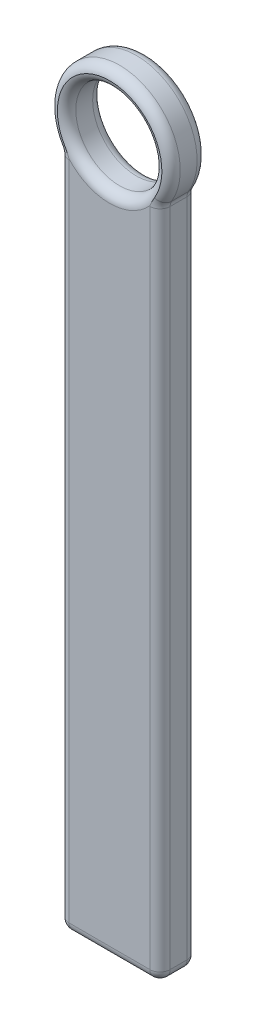
ISO-10303-21;
HEADER;
FILE_DESCRIPTION(('STEP AP214'),'2;1');
FILE_NAME('part.step','',(''),(''),'','','');
FILE_SCHEMA(('AUTOMOTIVE_DESIGN { 1 0 10303 214 1 1 1 1 }'));
ENDSEC;
DATA;
#1=APPLICATION_CONTEXT('core data for automotive mechanical design processes');
#2=APPLICATION_PROTOCOL_DEFINITION('international standard','automotive_design',2000,#1);
#3=PRODUCT_CONTEXT('',#1,'mechanical');
#4=PRODUCT('Part','Part','',(#3));
#5=PRODUCT_RELATED_PRODUCT_CATEGORY('part','',(#4));
#6=PRODUCT_DEFINITION_FORMATION('','',#4);
#7=PRODUCT_DEFINITION_CONTEXT('part definition',#1,'design');
#8=PRODUCT_DEFINITION('design','',#6,#7);
#9=PRODUCT_DEFINITION_SHAPE('','',#8);
#10=(LENGTH_UNIT() NAMED_UNIT(*) SI_UNIT(.MILLI.,.METRE.));
#11=(NAMED_UNIT(*) PLANE_ANGLE_UNIT() SI_UNIT($,.RADIAN.));
#12=(NAMED_UNIT(*) SI_UNIT($,.STERADIAN.) SOLID_ANGLE_UNIT());
#13=UNCERTAINTY_MEASURE_WITH_UNIT(LENGTH_MEASURE(1.E-05),#10,'distance_accuracy_value','');
#14=(GEOMETRIC_REPRESENTATION_CONTEXT(3) GLOBAL_UNCERTAINTY_ASSIGNED_CONTEXT((#13)) GLOBAL_UNIT_ASSIGNED_CONTEXT((#10,
#11,#12)) REPRESENTATION_CONTEXT('',''));
#15=CARTESIAN_POINT('',(0.,0.,0.));
#16=DIRECTION('',(0.,0.,1.));
#17=DIRECTION('',(1.,0.,0.));
#18=AXIS2_PLACEMENT_3D('',#15,#16,#17);
#19=CARTESIAN_POINT('',(0.,0.,5.5));
#20=DIRECTION('',(0.,0.,-1.));
#21=DIRECTION('',(-1.,0.,0.));
#22=AXIS2_PLACEMENT_3D('',#19,#20,#21);
#23=PLANE('',#22);
#24=DIRECTION('',(0.,1.,0.));
#25=VECTOR('',#24,1.);
#26=CARTESIAN_POINT('',(12.,0.,5.5));
#27=LINE('',#26,#25);
#28=CARTESIAN_POINT('',(12.,-206.949874371066,5.5));
#29=VERTEX_POINT('',#28);
#30=CARTESIAN_POINT('',(12.,-10.8166538263919,5.5));
#31=VERTEX_POINT('',#30);
#32=EDGE_CURVE('E431',#29,#31,#27,.T.);
#33=ORIENTED_EDGE('',*,*,#32,.T.);
#34=CARTESIAN_POINT('',(18.,-10.8166538263919,5.5));
#35=DIRECTION('',(0.,0.,-1.));
#36=DIRECTION('',(-1.,0.,0.));
#37=AXIS2_PLACEMENT_3D('',#34,#35,#36);
#38=CIRCLE('',#37,6.);
#39=CARTESIAN_POINT('',(12.0047640861216,-10.5776008261119,5.5));
#40=VERTEX_POINT('',#39);
#41=EDGE_CURVE('E438',#31,#40,#38,.T.);
#42=ORIENTED_EDGE('',*,*,#41,.T.);
#43=CARTESIAN_POINT('',(0.,0.,5.5));
#44=DIRECTION('',(0.,0.,-1.));
#45=DIRECTION('',(-1.,0.,0.));
#46=AXIS2_PLACEMENT_3D('',#43,#44,#45);
#47=CIRCLE('',#46,16.);
#48=CARTESIAN_POINT('',(-12.0047640861216,-10.5776008261119,5.5));
#49=VERTEX_POINT('',#48);
#50=EDGE_CURVE('E434',#40,#49,#47,.T.);
#51=ORIENTED_EDGE('',*,*,#50,.T.);
#52=CARTESIAN_POINT('',(-18.,-10.8166538263919,5.5));
#53=DIRECTION('',(0.,0.,-1.));
#54=DIRECTION('',(-1.,0.,0.));
#55=AXIS2_PLACEMENT_3D('',#52,#53,#54);
#56=CIRCLE('',#55,6.);
#57=CARTESIAN_POINT('',(-12.,-10.8166538263919,5.5));
#58=VERTEX_POINT('',#57);
#59=EDGE_CURVE('E428',#49,#58,#56,.T.);
#60=ORIENTED_EDGE('',*,*,#59,.T.);
#61=DIRECTION('',(0.,-1.,0.));
#62=VECTOR('',#61,1.);
#63=CARTESIAN_POINT('',(-12.,0.,5.5));
#64=LINE('',#63,#62);
#65=CARTESIAN_POINT('',(-12.,-206.949874371066,5.5));
#66=VERTEX_POINT('',#65);
#67=EDGE_CURVE('E422',#58,#66,#64,.T.);
#68=ORIENTED_EDGE('',*,*,#67,.T.);
#69=DIRECTION('',(1.,0.,0.));
#70=VECTOR('',#69,1.);
#71=CARTESIAN_POINT('',(0.,-206.949874371066,5.5));
#72=LINE('',#71,#70);
#73=EDGE_CURVE('E425',#66,#29,#72,.T.);
#74=ORIENTED_EDGE('',*,*,#73,.T.);
#75=EDGE_LOOP('',(#33,#42,#51,#60,#68,#74));
#76=FACE_BOUND('',#75,.T.);
#77=ADVANCED_FACE('F44',(#76),#23,.F.);
#78=CARTESIAN_POINT('',(0.,0.,-5.5));
#79=DIRECTION('',(0.,0.,-1.));
#80=DIRECTION('',(-1.,0.,0.));
#81=AXIS2_PLACEMENT_3D('',#78,#79,#80);
#82=PLANE('',#81);
#83=CARTESIAN_POINT('',(0.,0.,-5.5));
#84=DIRECTION('',(0.,0.,-1.));
#85=DIRECTION('',(-1.,0.,0.));
#86=AXIS2_PLACEMENT_3D('',#83,#84,#85);
#87=CIRCLE('',#86,16.);
#88=CARTESIAN_POINT('',(-12.0047640861216,-10.5776008261119,-5.5));
#89=VERTEX_POINT('',#88);
#90=CARTESIAN_POINT('',(12.0047640861216,-10.5776008261119,-5.5));
#91=VERTEX_POINT('',#90);
#92=EDGE_CURVE('E390',#89,#91,#87,.F.);
#93=ORIENTED_EDGE('',*,*,#92,.T.);
#94=CARTESIAN_POINT('',(18.,-10.8166538263919,-5.5));
#95=DIRECTION('',(0.,0.,-1.));
#96=DIRECTION('',(-1.,0.,0.));
#97=AXIS2_PLACEMENT_3D('',#94,#95,#96);
#98=CIRCLE('',#97,6.);
#99=CARTESIAN_POINT('',(12.,-10.8166538263919,-5.5));
#100=VERTEX_POINT('',#99);
#101=EDGE_CURVE('E398',#91,#100,#98,.F.);
#102=ORIENTED_EDGE('',*,*,#101,.T.);
#103=DIRECTION('',(0.,1.,0.));
#104=VECTOR('',#103,1.);
#105=CARTESIAN_POINT('',(12.,-209.949874371066,-5.5));
#106=LINE('',#105,#104);
#107=CARTESIAN_POINT('',(12.,-206.949874371066,-5.5));
#108=VERTEX_POINT('',#107);
#109=EDGE_CURVE('E386',#100,#108,#106,.F.);
#110=ORIENTED_EDGE('',*,*,#109,.T.);
#111=DIRECTION('',(1.,0.,0.));
#112=VECTOR('',#111,1.);
#113=CARTESIAN_POINT('',(-15.,-206.949874371066,-5.5));
#114=LINE('',#113,#112);
#115=CARTESIAN_POINT('',(-12.,-206.949874371066,-5.5));
#116=VERTEX_POINT('',#115);
#117=EDGE_CURVE('E384',#108,#116,#114,.F.);
#118=ORIENTED_EDGE('',*,*,#117,.T.);
#119=DIRECTION('',(0.,-1.,0.));
#120=VECTOR('',#119,1.);
#121=CARTESIAN_POINT('',(-12.,-9.94987437106617,-5.5));
#122=LINE('',#121,#120);
#123=CARTESIAN_POINT('',(-12.,-10.8166538263919,-5.5));
#124=VERTEX_POINT('',#123);
#125=EDGE_CURVE('E204',#116,#124,#122,.F.);
#126=ORIENTED_EDGE('',*,*,#125,.T.);
#127=CARTESIAN_POINT('',(-18.,-10.8166538263919,-5.5));
#128=DIRECTION('',(0.,0.,-1.));
#129=DIRECTION('',(-1.,0.,0.));
#130=AXIS2_PLACEMENT_3D('',#127,#128,#129);
#131=CIRCLE('',#130,6.);
#132=EDGE_CURVE('E392',#124,#89,#131,.F.);
#133=ORIENTED_EDGE('',*,*,#132,.T.);
#134=EDGE_LOOP('',(#93,#102,#110,#118,#126,#133));
#135=FACE_BOUND('',#134,.T.);
#136=ADVANCED_FACE('F273',(#135),#82,.T.);
#137=CARTESIAN_POINT('',(0.,0.,5.5));
#138=DIRECTION('',(0.,0.,-1.));
#139=DIRECTION('',(-1.,0.,0.));
#140=AXIS2_PLACEMENT_3D('',#137,#138,#139);
#141=CYLINDRICAL_SURFACE('',#140,18.);
#142=DIRECTION('',(0.,0.,-1.));
#143=VECTOR('',#142,1.);
#144=CARTESIAN_POINT('',(15.4285714285715,-9.2714175654788,5.5));
#145=LINE('',#144,#143);
#146=CARTESIAN_POINT('',(15.4285714285715,-9.27141756547879,2.5));
#147=VERTEX_POINT('',#146);
#148=CARTESIAN_POINT('',(15.4285714285715,-9.27141756547879,-2.5));
#149=VERTEX_POINT('',#148);
#150=EDGE_CURVE('E475',#147,#149,#145,.T.);
#151=ORIENTED_EDGE('',*,*,#150,.T.);
#152=CARTESIAN_POINT('',(0.,0.,-2.5));
#153=DIRECTION('',(0.,0.,-1.));
#154=DIRECTION('',(-1.,0.,0.));
#155=AXIS2_PLACEMENT_3D('',#152,#153,#154);
#156=CIRCLE('',#155,18.);
#157=CARTESIAN_POINT('',(-15.4285714285714,-9.2714175654788,-2.5));
#158=VERTEX_POINT('',#157);
#159=EDGE_CURVE('E473',#149,#158,#156,.F.);
#160=ORIENTED_EDGE('',*,*,#159,.T.);
#161=DIRECTION('',(0.,0.,-1.));
#162=VECTOR('',#161,1.);
#163=CARTESIAN_POINT('',(-15.4285714285714,-9.2714175654788,5.5));
#164=LINE('',#163,#162);
#165=CARTESIAN_POINT('',(-15.4285714285714,-9.2714175654788,2.5));
#166=VERTEX_POINT('',#165);
#167=EDGE_CURVE('E507',#158,#166,#164,.F.);
#168=ORIENTED_EDGE('',*,*,#167,.T.);
#169=CARTESIAN_POINT('',(0.,0.,2.5));
#170=DIRECTION('',(0.,0.,-1.));
#171=DIRECTION('',(-1.,0.,0.));
#172=AXIS2_PLACEMENT_3D('',#169,#170,#171);
#173=CIRCLE('',#172,18.);
#174=EDGE_CURVE('E510',#166,#147,#173,.T.);
#175=ORIENTED_EDGE('',*,*,#174,.T.);
#176=EDGE_LOOP('',(#151,#160,#168,#175));
#177=FACE_BOUND('',#176,.T.);
#178=ADVANCED_FACE('F279',(#177),#141,.T.);
#179=CARTESIAN_POINT('',(-15.,-9.94987437106617,5.5));
#180=DIRECTION('',(1.,0.,0.));
#181=DIRECTION('',(0.,1.,0.));
#182=AXIS2_PLACEMENT_3D('',#179,#180,#181);
#183=PLANE('',#182);
#184=DIRECTION('',(0.,-1.,0.));
#185=VECTOR('',#184,1.);
#186=CARTESIAN_POINT('',(-15.,-9.94987437106617,2.5));
#187=LINE('',#186,#185);
#188=CARTESIAN_POINT('',(-15.,-206.949874371066,2.5));
#189=VERTEX_POINT('',#188);
#190=CARTESIAN_POINT('',(-15.,-10.8166538263919,2.5));
#191=VERTEX_POINT('',#190);
#192=EDGE_CURVE('E55',#189,#191,#187,.F.);
#193=ORIENTED_EDGE('',*,*,#192,.T.);
#194=DIRECTION('',(0.,0.,1.));
#195=VECTOR('',#194,1.);
#196=CARTESIAN_POINT('',(-15.,-10.8166538263919,-5.5));
#197=LINE('',#196,#195);
#198=CARTESIAN_POINT('',(-15.,-10.8166538263919,-2.5));
#199=VERTEX_POINT('',#198);
#200=EDGE_CURVE('E11',#191,#199,#197,.F.);
#201=ORIENTED_EDGE('',*,*,#200,.T.);
#202=DIRECTION('',(0.,-1.,0.));
#203=VECTOR('',#202,1.);
#204=CARTESIAN_POINT('',(-15.,-209.949874371066,-2.5));
#205=LINE('',#204,#203);
#206=CARTESIAN_POINT('',(-15.,-206.949874371066,-2.5));
#207=VERTEX_POINT('',#206);
#208=EDGE_CURVE('E169',#199,#207,#205,.T.);
#209=ORIENTED_EDGE('',*,*,#208,.T.);
#210=DIRECTION('',(0.,0.,-1.));
#211=VECTOR('',#210,1.);
#212=CARTESIAN_POINT('',(-15.,-206.949874371066,5.5));
#213=LINE('',#212,#211);
#214=EDGE_CURVE('E172',#207,#189,#213,.F.);
#215=ORIENTED_EDGE('',*,*,#214,.T.);
#216=EDGE_LOOP('',(#193,#201,#209,#215));
#217=FACE_BOUND('',#216,.T.);
#218=ADVANCED_FACE('F171',(#217),#183,.F.);
#219=CARTESIAN_POINT('',(-15.,-209.949874371066,5.5));
#220=DIRECTION('',(0.,1.,0.));
#221=DIRECTION('',(0.,0.,1.));
#222=AXIS2_PLACEMENT_3D('',#219,#220,#221);
#223=PLANE('',#222);
#224=DIRECTION('',(0.,0.,-1.));
#225=VECTOR('',#224,1.);
#226=CARTESIAN_POINT('',(12.,-209.949874371066,5.5));
#227=LINE('',#226,#225);
#228=CARTESIAN_POINT('',(12.,-209.949874371066,-2.5));
#229=VERTEX_POINT('',#228);
#230=CARTESIAN_POINT('',(12.,-209.949874371066,2.5));
#231=VERTEX_POINT('',#230);
#232=EDGE_CURVE('E375',#229,#231,#227,.F.);
#233=ORIENTED_EDGE('',*,*,#232,.T.);
#234=DIRECTION('',(1.,0.,0.));
#235=VECTOR('',#234,1.);
#236=CARTESIAN_POINT('',(-15.,-209.949874371066,2.5));
#237=LINE('',#236,#235);
#238=CARTESIAN_POINT('',(-12.,-209.949874371066,2.5));
#239=VERTEX_POINT('',#238);
#240=EDGE_CURVE('E179',#231,#239,#237,.F.);
#241=ORIENTED_EDGE('',*,*,#240,.T.);
#242=DIRECTION('',(0.,0.,-1.));
#243=VECTOR('',#242,1.);
#244=CARTESIAN_POINT('',(-12.,-209.949874371066,5.5));
#245=LINE('',#244,#243);
#246=CARTESIAN_POINT('',(-12.,-209.949874371066,-2.5));
#247=VERTEX_POINT('',#246);
#248=EDGE_CURVE('E441',#239,#247,#245,.T.);
#249=ORIENTED_EDGE('',*,*,#248,.T.);
#250=DIRECTION('',(1.,0.,0.));
#251=VECTOR('',#250,1.);
#252=CARTESIAN_POINT('',(15.,-209.949874371066,-2.5));
#253=LINE('',#252,#251);
#254=EDGE_CURVE('E381',#247,#229,#253,.T.);
#255=ORIENTED_EDGE('',*,*,#254,.T.);
#256=EDGE_LOOP('',(#233,#241,#249,#255));
#257=FACE_BOUND('',#256,.T.);
#258=ADVANCED_FACE('F287',(#257),#223,.F.);
#259=CARTESIAN_POINT('',(15.,-209.949874371066,5.5));
#260=DIRECTION('',(-1.,0.,0.));
#261=DIRECTION('',(0.,0.,1.));
#262=AXIS2_PLACEMENT_3D('',#259,#260,#261);
#263=PLANE('',#262);
#264=DIRECTION('',(0.,1.,0.));
#265=VECTOR('',#264,1.);
#266=CARTESIAN_POINT('',(15.,-9.94987437106615,-2.5));
#267=LINE('',#266,#265);
#268=CARTESIAN_POINT('',(15.,-206.949874371066,-2.5));
#269=VERTEX_POINT('',#268);
#270=CARTESIAN_POINT('',(15.,-10.8166538263919,-2.5));
#271=VERTEX_POINT('',#270);
#272=EDGE_CURVE('E415',#269,#271,#267,.T.);
#273=ORIENTED_EDGE('',*,*,#272,.T.);
#274=DIRECTION('',(0.,0.,1.));
#275=VECTOR('',#274,1.);
#276=CARTESIAN_POINT('',(15.,-10.8166538263919,5.5));
#277=LINE('',#276,#275);
#278=CARTESIAN_POINT('',(15.,-10.8166538263919,2.5));
#279=VERTEX_POINT('',#278);
#280=EDGE_CURVE('E418',#271,#279,#277,.T.);
#281=ORIENTED_EDGE('',*,*,#280,.T.);
#282=DIRECTION('',(0.,1.,0.));
#283=VECTOR('',#282,1.);
#284=CARTESIAN_POINT('',(15.,-209.949874371066,2.5));
#285=LINE('',#284,#283);
#286=CARTESIAN_POINT('',(15.,-206.949874371066,2.5));
#287=VERTEX_POINT('',#286);
#288=EDGE_CURVE('E412',#279,#287,#285,.F.);
#289=ORIENTED_EDGE('',*,*,#288,.T.);
#290=DIRECTION('',(0.,0.,-1.));
#291=VECTOR('',#290,1.);
#292=CARTESIAN_POINT('',(15.,-206.949874371066,5.5));
#293=LINE('',#292,#291);
#294=EDGE_CURVE('E374',#287,#269,#293,.T.);
#295=ORIENTED_EDGE('',*,*,#294,.T.);
#296=EDGE_LOOP('',(#273,#281,#289,#295));
#297=FACE_BOUND('',#296,.T.);
#298=ADVANCED_FACE('F284',(#297),#263,.F.);
#299=CARTESIAN_POINT('',(0.,0.,5.5));
#300=DIRECTION('',(0.,0.,-1.));
#301=DIRECTION('',(-1.,0.,0.));
#302=AXIS2_PLACEMENT_3D('',#299,#300,#301);
#303=CYLINDRICAL_SURFACE('',#302,13.);
#304=CARTESIAN_POINT('',(0.,0.,-2.5));
#305=DIRECTION('',(0.,0.,-1.));
#306=DIRECTION('',(-1.,0.,0.));
#307=AXIS2_PLACEMENT_3D('',#304,#305,#306);
#308=CIRCLE('',#307,13.);
#309=CARTESIAN_POINT('',(-13.,0.,-2.5));
#310=VERTEX_POINT('',#309);
#311=EDGE_CURVE('E406',#310,#310,#308,.T.);
#312=ORIENTED_EDGE('',*,*,#311,.T.);
#313=EDGE_LOOP('',(#312));
#314=FACE_BOUND('',#313,.T.);
#315=CARTESIAN_POINT('',(0.,0.,2.5));
#316=DIRECTION('',(0.,0.,-1.));
#317=DIRECTION('',(-1.,0.,0.));
#318=AXIS2_PLACEMENT_3D('',#315,#316,#317);
#319=CIRCLE('',#318,13.);
#320=CARTESIAN_POINT('',(-13.,0.,2.5));
#321=VERTEX_POINT('',#320);
#322=EDGE_CURVE('E402',#321,#321,#319,.F.);
#323=ORIENTED_EDGE('',*,*,#322,.T.);
#324=EDGE_LOOP('',(#323));
#325=FACE_BOUND('',#324,.T.);
#326=ADVANCED_FACE('F269',(#314,#325),#303,.F.);
#327=CARTESIAN_POINT('',(-12.,-206.949874371066,2.5));
#328=DIRECTION('',(0.,0.,1.));
#329=DIRECTION('',(1.,0.,0.));
#330=AXIS2_PLACEMENT_3D('',#327,#328,#329);
#331=SPHERICAL_SURFACE('',#330,3.);
#332=CARTESIAN_POINT('',(-12.,-206.949874371066,2.5));
#333=DIRECTION('',(0.,0.,1.));
#334=DIRECTION('',(1.,0.,0.));
#335=AXIS2_PLACEMENT_3D('',#332,#333,#334);
#336=CIRCLE('',#335,3.);
#337=EDGE_CURVE('E188',#239,#189,#336,.F.);
#338=ORIENTED_EDGE('',*,*,#337,.F.);
#339=CARTESIAN_POINT('',(-12.,-206.949874371066,2.5));
#340=DIRECTION('',(-1.,0.,0.));
#341=DIRECTION('',(0.,0.,1.));
#342=AXIS2_PLACEMENT_3D('',#339,#340,#341);
#343=CIRCLE('',#342,3.);
#344=EDGE_CURVE('E48',#66,#239,#343,.F.);
#345=ORIENTED_EDGE('',*,*,#344,.F.);
#346=CARTESIAN_POINT('',(-12.,-206.949874371066,2.5));
#347=DIRECTION('',(0.,-1.,0.));
#348=DIRECTION('',(0.,0.,-1.));
#349=AXIS2_PLACEMENT_3D('',#346,#347,#348);
#350=CIRCLE('',#349,3.);
#351=EDGE_CURVE('E501',#189,#66,#350,.F.);
#352=ORIENTED_EDGE('',*,*,#351,.F.);
#353=EDGE_LOOP('',(#338,#345,#352));
#354=FACE_BOUND('',#353,.T.);
#355=ADVANCED_FACE('F46',(#354),#331,.T.);
#356=CARTESIAN_POINT('',(0.,-206.949874371066,2.5));
#357=DIRECTION('',(1.,0.,0.));
#358=DIRECTION('',(0.,0.,-1.));
#359=AXIS2_PLACEMENT_3D('',#356,#357,#358);
#360=CYLINDRICAL_SURFACE('',#359,3.);
#361=ORIENTED_EDGE('',*,*,#344,.T.);
#362=ORIENTED_EDGE('',*,*,#240,.F.);
#363=CARTESIAN_POINT('',(12.,-206.949874371066,2.5));
#364=DIRECTION('',(1.,0.,0.));
#365=DIRECTION('',(0.,0.,-1.));
#366=AXIS2_PLACEMENT_3D('',#363,#364,#365);
#367=CIRCLE('',#366,3.);
#368=EDGE_CURVE('E490',#29,#231,#367,.T.);
#369=ORIENTED_EDGE('',*,*,#368,.F.);
#370=ORIENTED_EDGE('',*,*,#73,.F.);
#371=EDGE_LOOP('',(#361,#362,#369,#370));
#372=FACE_BOUND('',#371,.T.);
#373=ADVANCED_FACE('F262',(#372),#360,.T.);
#374=CARTESIAN_POINT('',(-12.,0.,2.5));
#375=DIRECTION('',(0.,-1.,0.));
#376=DIRECTION('',(1.,0.,0.));
#377=AXIS2_PLACEMENT_3D('',#374,#375,#376);
#378=CYLINDRICAL_SURFACE('',#377,3.);
#379=ORIENTED_EDGE('',*,*,#351,.T.);
#380=ORIENTED_EDGE('',*,*,#67,.F.);
#381=CARTESIAN_POINT('',(-12.,-10.8166538263919,2.5));
#382=DIRECTION('',(0.,1.,0.));
#383=DIRECTION('',(0.,0.,1.));
#384=AXIS2_PLACEMENT_3D('',#381,#382,#383);
#385=CIRCLE('',#384,3.);
#386=EDGE_CURVE('E201',#191,#58,#385,.T.);
#387=ORIENTED_EDGE('',*,*,#386,.F.);
#388=ORIENTED_EDGE('',*,*,#192,.F.);
#389=EDGE_LOOP('',(#379,#380,#387,#388));
#390=FACE_BOUND('',#389,.T.);
#391=ADVANCED_FACE('F260',(#390),#378,.T.);
#392=CARTESIAN_POINT('',(-12.,-206.949874371066,5.5));
#393=DIRECTION('',(0.,0.,-1.));
#394=DIRECTION('',(-1.,0.,0.));
#395=AXIS2_PLACEMENT_3D('',#392,#393,#394);
#396=CYLINDRICAL_SURFACE('',#395,3.);
#397=ORIENTED_EDGE('',*,*,#337,.T.);
#398=ORIENTED_EDGE('',*,*,#214,.F.);
#399=CARTESIAN_POINT('',(-12.,-206.949874371066,-2.5));
#400=DIRECTION('',(0.,0.,-1.));
#401=DIRECTION('',(-1.,0.,0.));
#402=AXIS2_PLACEMENT_3D('',#399,#400,#401);
#403=CIRCLE('',#402,3.);
#404=EDGE_CURVE('E185',#247,#207,#403,.T.);
#405=ORIENTED_EDGE('',*,*,#404,.F.);
#406=ORIENTED_EDGE('',*,*,#248,.F.);
#407=EDGE_LOOP('',(#397,#398,#405,#406));
#408=FACE_BOUND('',#407,.T.);
#409=ADVANCED_FACE('F184',(#408),#396,.T.);
#410=CARTESIAN_POINT('',(12.,-206.949874371066,2.5));
#411=DIRECTION('',(0.,-1.,0.));
#412=DIRECTION('',(0.,0.,-1.));
#413=AXIS2_PLACEMENT_3D('',#410,#411,#412);
#414=SPHERICAL_SURFACE('',#413,3.);
#415=CARTESIAN_POINT('',(12.,-206.949874371066,2.5));
#416=DIRECTION('',(0.,-1.,0.));
#417=DIRECTION('',(0.,0.,-1.));
#418=AXIS2_PLACEMENT_3D('',#415,#416,#417);
#419=CIRCLE('',#418,3.);
#420=EDGE_CURVE('E231',#29,#287,#419,.F.);
#421=ORIENTED_EDGE('',*,*,#420,.F.);
#422=ORIENTED_EDGE('',*,*,#368,.T.);
#423=CARTESIAN_POINT('',(12.,-206.949874371066,2.5));
#424=DIRECTION('',(0.,0.,1.));
#425=DIRECTION('',(1.,0.,0.));
#426=AXIS2_PLACEMENT_3D('',#423,#424,#425);
#427=CIRCLE('',#426,3.);
#428=EDGE_CURVE('E377',#287,#231,#427,.F.);
#429=ORIENTED_EDGE('',*,*,#428,.F.);
#430=EDGE_LOOP('',(#421,#422,#429));
#431=FACE_BOUND('',#430,.T.);
#432=ADVANCED_FACE('F239',(#431),#414,.T.);
#433=CARTESIAN_POINT('',(-18.,-10.8166538263919,2.5));
#434=DIRECTION('',(0.,0.,-1.));
#435=DIRECTION('',(-1.,0.,0.));
#436=AXIS2_PLACEMENT_3D('',#433,#434,#435);
#437=TOROIDAL_SURFACE('',#436,6.,3.);
#438=ORIENTED_EDGE('',*,*,#386,.T.);
#439=ORIENTED_EDGE('',*,*,#59,.F.);
#440=CARTESIAN_POINT('',(-13.443722236149,-7.72598130456567,5.45898544962279));
#441=CARTESIAN_POINT('',(-13.3732136753188,-7.83873161454143,5.45813359682942));
#442=CARTESIAN_POINT('',(-13.3040274264423,-7.95231199171408,5.45786318021208));
#443=CARTESIAN_POINT('',(-13.1683329660892,-8.18105183606779,5.45841085195117));
#444=CARTESIAN_POINT('',(-13.1018246307492,-8.2962112298825,5.45922888990284));
#445=CARTESIAN_POINT('',(-12.9715186118357,-8.52802831397769,5.46187892161859));
#446=CARTESIAN_POINT('',(-12.9077206901227,-8.64468587145036,5.46371082610421));
#447=CARTESIAN_POINT('',(-12.7828286486175,-8.8794231846495,5.46813344774649));
#448=CARTESIAN_POINT('',(-12.7217345418564,-8.99750294722682,5.47072416855983));
#449=CARTESIAN_POINT('',(-12.5429401142492,-9.35283284658054,5.47909798950053));
#450=CARTESIAN_POINT('',(-12.4292198672603,-9.592078919593,5.48549810508025));
#451=CARTESIAN_POINT('',(-12.2120296901076,-10.0751807324819,5.49587958021145));
#452=CARTESIAN_POINT('',(-12.1085573214585,-10.3190353592265,5.49986151633224));
#453=CARTESIAN_POINT('',(-12.0081855960832,-10.5690651511877,5.49999880681377));
#454=CARTESIAN_POINT('',(-12.0064741163637,-10.5733327021532,5.49999999013992));
#455=CARTESIAN_POINT('',(-12.0047640861216,-10.5776008261119,5.5));
#456=B_SPLINE_CURVE_WITH_KNOTS('',3,(#440,#441,#442,#443,#444,#445,#446,#447,#448,#449,#450,
#451,#452,#453,#454,#455),.UNSPECIFIED.,.F.,.F.,(4,2,2,2,2,2,2,4),(0.,0.398940822497486,
0.797863171269176,1.19675039755567,1.59563954607793,2.39030653128708,3.18478396866876,
3.19857782085806),.UNSPECIFIED.);
#457=CARTESIAN_POINT('',(-13.2857142857143,-7.98372068138452,5.45803989154981));
#458=VERTEX_POINT('',#457);
#459=EDGE_CURVE('E87',#458,#49,#456,.T.);
#460=ORIENTED_EDGE('',*,*,#459,.F.);
#461=CARTESIAN_POINT('',(-12.8571428571429,-7.72618130456567,2.5));
#462=DIRECTION('',(0.515078753637711,-0.857142857142858,0.));
#463=DIRECTION('',(0.857142857142858,0.515078753637711,0.));
#464=AXIS2_PLACEMENT_3D('',#461,#462,#463);
#465=CIRCLE('',#464,3.);
#466=EDGE_CURVE('E212',#166,#458,#465,.F.);
#467=ORIENTED_EDGE('',*,*,#466,.F.);
#468=CARTESIAN_POINT('',(-18.,-10.8166538263919,2.5));
#469=DIRECTION('',(0.,0.,-1.));
#470=DIRECTION('',(-1.,0.,0.));
#471=AXIS2_PLACEMENT_3D('',#468,#469,#470);
#472=CIRCLE('',#471,3.);
#473=EDGE_CURVE('E206',#191,#166,#472,.F.);
#474=ORIENTED_EDGE('',*,*,#473,.F.);
#475=EDGE_LOOP('',(#438,#439,#460,#467,#474));
#476=FACE_BOUND('',#475,.T.);
#477=ADVANCED_FACE('F235',(#476),#437,.T.);
#478=CARTESIAN_POINT('',(-12.,-206.949874371066,-2.5));
#479=DIRECTION('',(0.,-1.,0.));
#480=DIRECTION('',(0.,0.,-1.));
#481=AXIS2_PLACEMENT_3D('',#478,#479,#480);
#482=SPHERICAL_SURFACE('',#481,3.);
#483=CARTESIAN_POINT('',(-12.,-206.949874371066,-2.5));
#484=DIRECTION('',(0.,-1.,0.));
#485=DIRECTION('',(0.,0.,-1.));
#486=AXIS2_PLACEMENT_3D('',#483,#484,#485);
#487=CIRCLE('',#486,3.);
#488=EDGE_CURVE('E195',#116,#207,#487,.F.);
#489=ORIENTED_EDGE('',*,*,#488,.F.);
#490=CARTESIAN_POINT('',(-12.,-206.949874371066,-2.5));
#491=DIRECTION('',(-1.,0.,0.));
#492=DIRECTION('',(0.,0.,1.));
#493=AXIS2_PLACEMENT_3D('',#490,#491,#492);
#494=CIRCLE('',#493,3.);
#495=EDGE_CURVE('E198',#247,#116,#494,.F.);
#496=ORIENTED_EDGE('',*,*,#495,.F.);
#497=ORIENTED_EDGE('',*,*,#404,.T.);
#498=EDGE_LOOP('',(#489,#496,#497));
#499=FACE_BOUND('',#498,.T.);
#500=ADVANCED_FACE('F194',(#499),#482,.T.);
#501=CARTESIAN_POINT('',(-15.,-206.949874371066,-2.5));
#502=DIRECTION('',(-1.,0.,0.));
#503=DIRECTION('',(0.,0.,1.));
#504=AXIS2_PLACEMENT_3D('',#501,#502,#503);
#505=CYLINDRICAL_SURFACE('',#504,3.);
#506=ORIENTED_EDGE('',*,*,#495,.T.);
#507=ORIENTED_EDGE('',*,*,#117,.F.);
#508=CARTESIAN_POINT('',(12.,-206.949874371066,-2.5));
#509=DIRECTION('',(1.,0.,0.));
#510=DIRECTION('',(0.,0.,-1.));
#511=AXIS2_PLACEMENT_3D('',#508,#509,#510);
#512=CIRCLE('',#511,3.);
#513=EDGE_CURVE('E207',#229,#108,#512,.T.);
#514=ORIENTED_EDGE('',*,*,#513,.F.);
#515=ORIENTED_EDGE('',*,*,#254,.F.);
#516=EDGE_LOOP('',(#506,#507,#514,#515));
#517=FACE_BOUND('',#516,.T.);
#518=ADVANCED_FACE('F248',(#517),#505,.T.);
#519=CARTESIAN_POINT('',(12.,-206.949874371066,5.5));
#520=DIRECTION('',(0.,0.,-1.));
#521=DIRECTION('',(-1.,0.,0.));
#522=AXIS2_PLACEMENT_3D('',#519,#520,#521);
#523=CYLINDRICAL_SURFACE('',#522,3.);
#524=ORIENTED_EDGE('',*,*,#428,.T.);
#525=ORIENTED_EDGE('',*,*,#232,.F.);
#526=CARTESIAN_POINT('',(12.,-206.949874371066,-2.5));
#527=DIRECTION('',(0.,0.,-1.));
#528=DIRECTION('',(-1.,0.,0.));
#529=AXIS2_PLACEMENT_3D('',#526,#527,#528);
#530=CIRCLE('',#529,3.);
#531=EDGE_CURVE('E215',#269,#229,#530,.T.);
#532=ORIENTED_EDGE('',*,*,#531,.F.);
#533=ORIENTED_EDGE('',*,*,#294,.F.);
#534=EDGE_LOOP('',(#524,#525,#532,#533));
#535=FACE_BOUND('',#534,.T.);
#536=ADVANCED_FACE('F244',(#535),#523,.T.);
#537=CARTESIAN_POINT('',(12.,0.,2.5));
#538=DIRECTION('',(0.,1.,0.));
#539=DIRECTION('',(0.,0.,1.));
#540=AXIS2_PLACEMENT_3D('',#537,#538,#539);
#541=CYLINDRICAL_SURFACE('',#540,3.);
#542=ORIENTED_EDGE('',*,*,#420,.T.);
#543=ORIENTED_EDGE('',*,*,#288,.F.);
#544=CARTESIAN_POINT('',(12.,-10.8166538263919,2.5));
#545=DIRECTION('',(0.,1.,0.));
#546=DIRECTION('',(0.,0.,1.));
#547=AXIS2_PLACEMENT_3D('',#544,#545,#546);
#548=CIRCLE('',#547,3.);
#549=EDGE_CURVE('E359',#31,#279,#548,.T.);
#550=ORIENTED_EDGE('',*,*,#549,.F.);
#551=ORIENTED_EDGE('',*,*,#32,.F.);
#552=EDGE_LOOP('',(#542,#543,#550,#551));
#553=FACE_BOUND('',#552,.T.);
#554=ADVANCED_FACE('F240',(#553),#541,.T.);
#555=CARTESIAN_POINT('',(0.,0.,2.5));
#556=DIRECTION('',(0.,0.,-1.));
#557=DIRECTION('',(-1.,0.,0.));
#558=AXIS2_PLACEMENT_3D('',#555,#556,#557);
#559=TOROIDAL_SURFACE('',#558,16.,3.);
#560=ORIENTED_EDGE('',*,*,#322,.F.);
#561=EDGE_LOOP('',(#560));
#562=FACE_BOUND('',#561,.T.);
#563=CARTESIAN_POINT('',(0.,0.,5.45803989154981));
#564=DIRECTION('',(0.,0.,1.));
#565=DIRECTION('',(1.,0.,0.));
#566=AXIS2_PLACEMENT_3D('',#563,#564,#565);
#567=CIRCLE('',#566,15.5);
#568=CARTESIAN_POINT('',(13.2857142857143,-7.98372068138452,5.45803989154981));
#569=VERTEX_POINT('',#568);
#570=EDGE_CURVE('E79',#458,#569,#567,.F.);
#571=ORIENTED_EDGE('',*,*,#570,.F.);
#572=ORIENTED_EDGE('',*,*,#459,.T.);
#573=ORIENTED_EDGE('',*,*,#50,.F.);
#574=CARTESIAN_POINT('',(12.0047640861216,-10.5776008261119,5.5));
#575=CARTESIAN_POINT('',(12.0064741163637,-10.5733327021532,5.49999999013992));
#576=CARTESIAN_POINT('',(12.0081855960831,-10.5690651511876,5.49999880681377));
#577=CARTESIAN_POINT('',(12.1085573214555,-10.3190353592255,5.49986151633224));
#578=CARTESIAN_POINT('',(12.2120296901067,-10.0751807324819,5.49587958021146));
#579=CARTESIAN_POINT('',(12.4292198672608,-9.59207891959384,5.48549810508026));
#580=CARTESIAN_POINT('',(12.5429401142491,-9.3528328465812,5.47909798950054));
#581=CARTESIAN_POINT('',(12.7217345418561,-8.99750294722734,5.47072416855984));
#582=CARTESIAN_POINT('',(12.7828286486173,-8.87942318464992,5.4681334477465));
#583=CARTESIAN_POINT('',(12.9077206901226,-8.64468587145055,5.46371082610421));
#584=CARTESIAN_POINT('',(12.9715186118356,-8.52802831397775,5.46187892161859));
#585=CARTESIAN_POINT('',(13.1018246307492,-8.29621122988243,5.45922888990284));
#586=CARTESIAN_POINT('',(13.1683329660892,-8.18105183606773,5.45841085195117));
#587=CARTESIAN_POINT('',(13.3040274264424,-7.95231199171404,5.45786318021208));
#588=CARTESIAN_POINT('',(13.3732136753188,-7.83873161454142,5.45813359682942));
#589=CARTESIAN_POINT('',(13.443722236149,-7.72598130456566,5.45898544962279));
#590=B_SPLINE_CURVE_WITH_KNOTS('',3,(#574,#575,#576,#577,#578,#579,#580,#581,#582,#583,#584,
#585,#586,#587,#588,#589),.UNSPECIFIED.,.F.,.F.,(4,2,2,2,2,2,2,4),(0.,0.0137938521893231,
0.808271289570477,1.60293827477937,2.00182742330203,2.40071464958896,2.79963699836064,
3.19857782085806),.UNSPECIFIED.);
#591=EDGE_CURVE('E350',#569,#40,#590,.F.);
#592=ORIENTED_EDGE('',*,*,#591,.F.);
#593=EDGE_LOOP('',(#571,#572,#573,#592));
#594=FACE_BOUND('',#593,.T.);
#595=ADVANCED_FACE('F243',(#562,#594),#559,.T.);
#596=CARTESIAN_POINT('',(0.,0.,2.5));
#597=DIRECTION('',(0.,0.,-1.));
#598=DIRECTION('',(-1.,0.,0.));
#599=AXIS2_PLACEMENT_3D('',#596,#597,#598);
#600=TOROIDAL_SURFACE('',#599,15.,3.);
#601=ORIENTED_EDGE('',*,*,#466,.T.);
#602=ORIENTED_EDGE('',*,*,#570,.T.);
#603=CARTESIAN_POINT('',(12.8571428571429,-7.72618130456566,2.5));
#604=DIRECTION('',(-0.515078753637711,-0.857142857142858,0.));
#605=DIRECTION('',(0.857142857142858,-0.515078753637711,0.));
#606=AXIS2_PLACEMENT_3D('',#603,#604,#605);
#607=CIRCLE('',#606,3.);
#608=EDGE_CURVE('E360',#147,#569,#607,.T.);
#609=ORIENTED_EDGE('',*,*,#608,.F.);
#610=ORIENTED_EDGE('',*,*,#174,.F.);
#611=EDGE_LOOP('',(#601,#602,#609,#610));
#612=FACE_BOUND('',#611,.T.);
#613=ADVANCED_FACE('F345',(#612),#600,.T.);
#614=CARTESIAN_POINT('',(-18.,-10.8166538263919,5.5));
#615=DIRECTION('',(0.,0.,-1.));
#616=DIRECTION('',(-1.,0.,0.));
#617=AXIS2_PLACEMENT_3D('',#614,#615,#616);
#618=CYLINDRICAL_SURFACE('',#617,3.);
#619=ORIENTED_EDGE('',*,*,#473,.T.);
#620=ORIENTED_EDGE('',*,*,#167,.F.);
#621=CARTESIAN_POINT('',(-18.,-10.8166538263919,-2.5));
#622=DIRECTION('',(0.,0.,-1.));
#623=DIRECTION('',(-1.,0.,0.));
#624=AXIS2_PLACEMENT_3D('',#621,#622,#623);
#625=CIRCLE('',#624,3.);
#626=EDGE_CURVE('E522',#199,#158,#625,.F.);
#627=ORIENTED_EDGE('',*,*,#626,.F.);
#628=ORIENTED_EDGE('',*,*,#200,.F.);
#629=EDGE_LOOP('',(#619,#620,#627,#628));
#630=FACE_BOUND('',#629,.T.);
#631=ADVANCED_FACE('F530',(#630),#618,.F.);
#632=CARTESIAN_POINT('',(-12.,-9.94987437106617,-2.5));
#633=DIRECTION('',(0.,1.,0.));
#634=DIRECTION('',(-1.,0.,0.));
#635=AXIS2_PLACEMENT_3D('',#632,#633,#634);
#636=CYLINDRICAL_SURFACE('',#635,3.);
#637=ORIENTED_EDGE('',*,*,#488,.T.);
#638=ORIENTED_EDGE('',*,*,#208,.F.);
#639=CARTESIAN_POINT('',(-12.,-10.8166538263919,-2.5));
#640=DIRECTION('',(0.,1.,0.));
#641=DIRECTION('',(0.,0.,1.));
#642=AXIS2_PLACEMENT_3D('',#639,#640,#641);
#643=CIRCLE('',#642,3.);
#644=EDGE_CURVE('E335',#124,#199,#643,.T.);
#645=ORIENTED_EDGE('',*,*,#644,.F.);
#646=ORIENTED_EDGE('',*,*,#125,.F.);
#647=EDGE_LOOP('',(#637,#638,#645,#646));
#648=FACE_BOUND('',#647,.T.);
#649=ADVANCED_FACE('F203',(#648),#636,.T.);
#650=CARTESIAN_POINT('',(12.,-206.949874371066,-2.5));
#651=DIRECTION('',(0.,-1.,0.));
#652=DIRECTION('',(0.,0.,-1.));
#653=AXIS2_PLACEMENT_3D('',#650,#651,#652);
#654=SPHERICAL_SURFACE('',#653,3.);
#655=ORIENTED_EDGE('',*,*,#531,.T.);
#656=ORIENTED_EDGE('',*,*,#513,.T.);
#657=CARTESIAN_POINT('',(12.,-206.949874371066,-2.5));
#658=DIRECTION('',(0.,-1.,0.));
#659=DIRECTION('',(0.,0.,-1.));
#660=AXIS2_PLACEMENT_3D('',#657,#658,#659);
#661=CIRCLE('',#660,3.);
#662=EDGE_CURVE('E322',#269,#108,#661,.F.);
#663=ORIENTED_EDGE('',*,*,#662,.F.);
#664=EDGE_LOOP('',(#655,#656,#663));
#665=FACE_BOUND('',#664,.T.);
#666=ADVANCED_FACE('F368',(#665),#654,.T.);
#667=CARTESIAN_POINT('',(18.,-10.8166538263919,2.5));
#668=DIRECTION('',(0.,0.,-1.));
#669=DIRECTION('',(-1.,0.,0.));
#670=AXIS2_PLACEMENT_3D('',#667,#668,#669);
#671=TOROIDAL_SURFACE('',#670,6.,3.);
#672=ORIENTED_EDGE('',*,*,#41,.F.);
#673=ORIENTED_EDGE('',*,*,#549,.T.);
#674=CARTESIAN_POINT('',(18.,-10.8166538263919,2.5));
#675=DIRECTION('',(0.,0.,-1.));
#676=DIRECTION('',(-1.,0.,0.));
#677=AXIS2_PLACEMENT_3D('',#674,#675,#676);
#678=CIRCLE('',#677,3.);
#679=EDGE_CURVE('E319',#147,#279,#678,.F.);
#680=ORIENTED_EDGE('',*,*,#679,.F.);
#681=ORIENTED_EDGE('',*,*,#608,.T.);
#682=ORIENTED_EDGE('',*,*,#591,.T.);
#683=EDGE_LOOP('',(#672,#673,#680,#681,#682));
#684=FACE_BOUND('',#683,.T.);
#685=ADVANCED_FACE('F524',(#684),#671,.T.);
#686=CARTESIAN_POINT('',(-18.,-10.8166538263919,-2.5));
#687=DIRECTION('',(0.,0.,-1.));
#688=DIRECTION('',(-1.,0.,0.));
#689=AXIS2_PLACEMENT_3D('',#686,#687,#688);
#690=TOROIDAL_SURFACE('',#689,6.,3.);
#691=CARTESIAN_POINT('',(-13.443722236149,-7.72598130456567,-5.45898544962279));
#692=CARTESIAN_POINT('',(-13.3732136753188,-7.83873161454143,-5.45813359682942));
#693=CARTESIAN_POINT('',(-13.3040274264423,-7.95231199171408,-5.45786318021208));
#694=CARTESIAN_POINT('',(-13.1683329660892,-8.18105183606779,-5.45841085195117));
#695=CARTESIAN_POINT('',(-13.1018246307492,-8.2962112298825,-5.45922888990284));
#696=CARTESIAN_POINT('',(-12.9715186118357,-8.52802831397769,-5.46187892161859));
#697=CARTESIAN_POINT('',(-12.9077206901227,-8.64468587145036,-5.46371082610421));
#698=CARTESIAN_POINT('',(-12.7828286486175,-8.8794231846495,-5.46813344774649));
#699=CARTESIAN_POINT('',(-12.7217345418564,-8.99750294722682,-5.47072416855983));
#700=CARTESIAN_POINT('',(-12.5429401142492,-9.35283284658054,-5.47909798950053));
#701=CARTESIAN_POINT('',(-12.4292198672603,-9.592078919593,-5.48549810508025));
#702=CARTESIAN_POINT('',(-12.2120296901076,-10.0751807324819,-5.49587958021145));
#703=CARTESIAN_POINT('',(-12.1085573214585,-10.3190353592265,-5.49986151633224));
#704=CARTESIAN_POINT('',(-12.0081855960832,-10.5690651511877,-5.49999880681377));
#705=CARTESIAN_POINT('',(-12.0064741163637,-10.5733327021532,-5.49999999013992));
#706=CARTESIAN_POINT('',(-12.0047640861216,-10.5776008261119,-5.5));
#707=B_SPLINE_CURVE_WITH_KNOTS('',3,(#691,#692,#693,#694,#695,#696,#697,#698,#699,#700,#701,
#702,#703,#704,#705,#706),.UNSPECIFIED.,.F.,.F.,(4,2,2,2,2,2,2,4),(0.,0.398940822497486,
0.797863171269176,1.19675039755567,1.59563954607793,2.39030653128708,3.18478396866876,
3.19857782085806),.UNSPECIFIED.);
#708=CARTESIAN_POINT('',(-13.2857142857143,-7.98372068138452,-5.45803989154981));
#709=VERTEX_POINT('',#708);
#710=EDGE_CURVE('E326',#89,#709,#707,.F.);
#711=ORIENTED_EDGE('',*,*,#710,.F.);
#712=ORIENTED_EDGE('',*,*,#132,.F.);
#713=ORIENTED_EDGE('',*,*,#644,.T.);
#714=ORIENTED_EDGE('',*,*,#626,.T.);
#715=CARTESIAN_POINT('',(-12.8571428571429,-7.72618130456567,-2.5));
#716=DIRECTION('',(0.515078753637711,-0.857142857142858,0.));
#717=DIRECTION('',(0.857142857142858,0.515078753637711,0.));
#718=AXIS2_PLACEMENT_3D('',#715,#716,#717);
#719=CIRCLE('',#718,3.);
#720=EDGE_CURVE('E95',#709,#158,#719,.F.);
#721=ORIENTED_EDGE('',*,*,#720,.F.);
#722=EDGE_LOOP('',(#711,#712,#713,#714,#721));
#723=FACE_BOUND('',#722,.T.);
#724=ADVANCED_FACE('F337',(#723),#690,.T.);
#725=CARTESIAN_POINT('',(0.,0.,-2.5));
#726=DIRECTION('',(0.,0.,-1.));
#727=DIRECTION('',(-1.,0.,0.));
#728=AXIS2_PLACEMENT_3D('',#725,#726,#727);
#729=TOROIDAL_SURFACE('',#728,16.,3.);
#730=ORIENTED_EDGE('',*,*,#311,.F.);
#731=EDGE_LOOP('',(#730));
#732=FACE_BOUND('',#731,.T.);
#733=ORIENTED_EDGE('',*,*,#92,.F.);
#734=ORIENTED_EDGE('',*,*,#710,.T.);
#735=CARTESIAN_POINT('',(0.,0.,-5.45803989154981));
#736=DIRECTION('',(0.,0.,1.));
#737=DIRECTION('',(1.,0.,0.));
#738=AXIS2_PLACEMENT_3D('',#735,#736,#737);
#739=CIRCLE('',#738,15.5);
#740=CARTESIAN_POINT('',(13.2857142857143,-7.98372068138452,-5.45803989154981));
#741=VERTEX_POINT('',#740);
#742=EDGE_CURVE('E312',#741,#709,#739,.T.);
#743=ORIENTED_EDGE('',*,*,#742,.F.);
#744=CARTESIAN_POINT('',(12.0047640861216,-10.5776008261119,-5.5));
#745=CARTESIAN_POINT('',(12.0064741163637,-10.5733327021532,-5.49999999013992));
#746=CARTESIAN_POINT('',(12.0081855960831,-10.5690651511876,-5.49999880681377));
#747=CARTESIAN_POINT('',(12.1085573214555,-10.3190353592255,-5.49986151633224));
#748=CARTESIAN_POINT('',(12.2120296901067,-10.0751807324819,-5.49587958021146));
#749=CARTESIAN_POINT('',(12.4292198672608,-9.59207891959384,-5.48549810508026));
#750=CARTESIAN_POINT('',(12.5429401142491,-9.3528328465812,-5.47909798950054));
#751=CARTESIAN_POINT('',(12.7217345418561,-8.99750294722734,-5.47072416855984));
#752=CARTESIAN_POINT('',(12.7828286486173,-8.87942318464992,-5.4681334477465));
#753=CARTESIAN_POINT('',(12.9077206901226,-8.64468587145055,-5.46371082610421));
#754=CARTESIAN_POINT('',(12.9715186118356,-8.52802831397775,-5.46187892161859));
#755=CARTESIAN_POINT('',(13.1018246307492,-8.29621122988243,-5.45922888990284));
#756=CARTESIAN_POINT('',(13.1683329660892,-8.18105183606773,-5.45841085195117));
#757=CARTESIAN_POINT('',(13.3040274264424,-7.95231199171404,-5.45786318021208));
#758=CARTESIAN_POINT('',(13.3732136753188,-7.83873161454142,-5.45813359682942));
#759=CARTESIAN_POINT('',(13.443722236149,-7.72598130456566,-5.45898544962279));
#760=B_SPLINE_CURVE_WITH_KNOTS('',3,(#744,#745,#746,#747,#748,#749,#750,#751,#752,#753,#754,
#755,#756,#757,#758,#759),.UNSPECIFIED.,.F.,.F.,(4,2,2,2,2,2,2,4),(0.,0.0137938521893231,
0.808271289570477,1.60293827477937,2.00182742330203,2.40071464958896,2.79963699836064,
3.19857782085806),.UNSPECIFIED.);
#761=EDGE_CURVE('E303',#91,#741,#760,.T.);
#762=ORIENTED_EDGE('',*,*,#761,.F.);
#763=EDGE_LOOP('',(#733,#734,#743,#762));
#764=FACE_BOUND('',#763,.T.);
#765=ADVANCED_FACE('F299',(#732,#764),#729,.T.);
#766=CARTESIAN_POINT('',(12.,-209.949874371066,-2.5));
#767=DIRECTION('',(0.,-1.,0.));
#768=DIRECTION('',(0.,0.,-1.));
#769=AXIS2_PLACEMENT_3D('',#766,#767,#768);
#770=CYLINDRICAL_SURFACE('',#769,3.);
#771=ORIENTED_EDGE('',*,*,#662,.T.);
#772=ORIENTED_EDGE('',*,*,#109,.F.);
#773=CARTESIAN_POINT('',(12.,-10.8166538263919,-2.5));
#774=DIRECTION('',(0.,1.,0.));
#775=DIRECTION('',(0.,0.,1.));
#776=AXIS2_PLACEMENT_3D('',#773,#774,#775);
#777=CIRCLE('',#776,3.);
#778=EDGE_CURVE('E313',#271,#100,#777,.T.);
#779=ORIENTED_EDGE('',*,*,#778,.F.);
#780=ORIENTED_EDGE('',*,*,#272,.F.);
#781=EDGE_LOOP('',(#771,#772,#779,#780));
#782=FACE_BOUND('',#781,.T.);
#783=ADVANCED_FACE('F464',(#782),#770,.T.);
#784=CARTESIAN_POINT('',(18.,-10.8166538263919,5.5));
#785=DIRECTION('',(0.,0.,-1.));
#786=DIRECTION('',(-1.,0.,0.));
#787=AXIS2_PLACEMENT_3D('',#784,#785,#786);
#788=CYLINDRICAL_SURFACE('',#787,3.);
#789=ORIENTED_EDGE('',*,*,#679,.T.);
#790=ORIENTED_EDGE('',*,*,#280,.F.);
#791=CARTESIAN_POINT('',(18.,-10.8166538263919,-2.5));
#792=DIRECTION('',(0.,0.,-1.));
#793=DIRECTION('',(-1.,0.,0.));
#794=AXIS2_PLACEMENT_3D('',#791,#792,#793);
#795=CIRCLE('',#794,3.);
#796=EDGE_CURVE('E453',#149,#271,#795,.F.);
#797=ORIENTED_EDGE('',*,*,#796,.F.);
#798=ORIENTED_EDGE('',*,*,#150,.F.);
#799=EDGE_LOOP('',(#789,#790,#797,#798));
#800=FACE_BOUND('',#799,.T.);
#801=ADVANCED_FACE('F480',(#800),#788,.F.);
#802=CARTESIAN_POINT('',(0.,0.,-2.5));
#803=DIRECTION('',(0.,0.,-1.));
#804=DIRECTION('',(-1.,0.,0.));
#805=AXIS2_PLACEMENT_3D('',#802,#803,#804);
#806=TOROIDAL_SURFACE('',#805,15.,3.);
#807=ORIENTED_EDGE('',*,*,#720,.T.);
#808=ORIENTED_EDGE('',*,*,#159,.F.);
#809=CARTESIAN_POINT('',(12.8571428571429,-7.72618130456566,-2.5));
#810=DIRECTION('',(-0.515078753637711,-0.857142857142858,0.));
#811=DIRECTION('',(0.857142857142858,-0.515078753637711,0.));
#812=AXIS2_PLACEMENT_3D('',#809,#810,#811);
#813=CIRCLE('',#812,3.);
#814=EDGE_CURVE('E450',#741,#149,#813,.T.);
#815=ORIENTED_EDGE('',*,*,#814,.F.);
#816=ORIENTED_EDGE('',*,*,#742,.T.);
#817=EDGE_LOOP('',(#807,#808,#815,#816));
#818=FACE_BOUND('',#817,.T.);
#819=ADVANCED_FACE('F471',(#818),#806,.T.);
#820=CARTESIAN_POINT('',(18.,-10.8166538263919,-2.5));
#821=DIRECTION('',(0.,0.,-1.));
#822=DIRECTION('',(-1.,0.,0.));
#823=AXIS2_PLACEMENT_3D('',#820,#821,#822);
#824=TOROIDAL_SURFACE('',#823,6.,3.);
#825=ORIENTED_EDGE('',*,*,#101,.F.);
#826=ORIENTED_EDGE('',*,*,#761,.T.);
#827=ORIENTED_EDGE('',*,*,#814,.T.);
#828=ORIENTED_EDGE('',*,*,#796,.T.);
#829=ORIENTED_EDGE('',*,*,#778,.T.);
#830=EDGE_LOOP('',(#825,#826,#827,#828,#829));
#831=FACE_BOUND('',#830,.T.);
#832=ADVANCED_FACE('F462',(#831),#824,.T.);
#833=CLOSED_SHELL('',(#77,#136,#178,#218,#258,#298,#326,#355,#373,#391,#409,#432,#477,#500,#518,
#536,#554,#595,#613,#631,#649,#666,#685,#724,#765,#783,#801,#819,#832));
#834=MANIFOLD_SOLID_BREP('B2',#833);
#835=ADVANCED_BREP_SHAPE_REPRESENTATION('',(#18,#834),#14);
#836=SHAPE_DEFINITION_REPRESENTATION(#9,#835);
ENDSEC;
END-ISO-10303-21;
